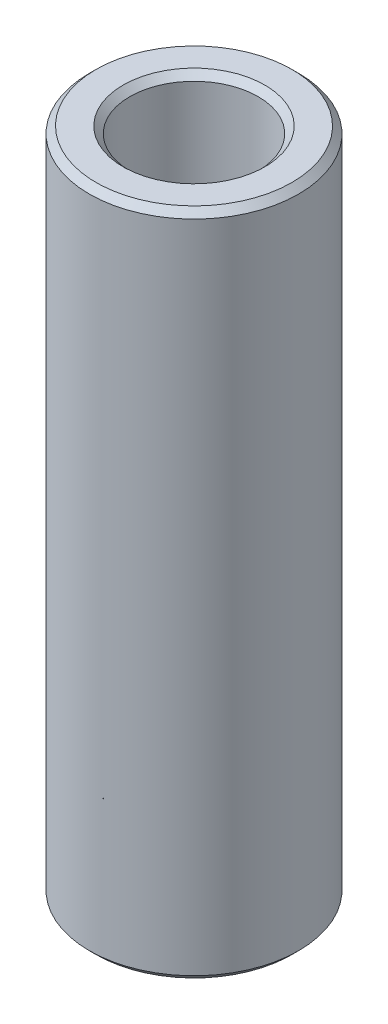
ISO-10303-21;
HEADER;
FILE_DESCRIPTION(('STEP AP214'),'2;1');
FILE_NAME('part.step','',(''),(''),'','','');
FILE_SCHEMA(('AUTOMOTIVE_DESIGN { 1 0 10303 214 1 1 1 1 }'));
ENDSEC;
DATA;
#1=APPLICATION_CONTEXT('core data for automotive mechanical design processes');
#2=APPLICATION_PROTOCOL_DEFINITION('international standard','automotive_design',2000,#1);
#3=PRODUCT_CONTEXT('',#1,'mechanical');
#4=PRODUCT('Part','Part','',(#3));
#5=PRODUCT_RELATED_PRODUCT_CATEGORY('part','',(#4));
#6=PRODUCT_DEFINITION_FORMATION('','',#4);
#7=PRODUCT_DEFINITION_CONTEXT('part definition',#1,'design');
#8=PRODUCT_DEFINITION('design','',#6,#7);
#9=PRODUCT_DEFINITION_SHAPE('','',#8);
#10=(LENGTH_UNIT() NAMED_UNIT(*) SI_UNIT(.MILLI.,.METRE.));
#11=(NAMED_UNIT(*) PLANE_ANGLE_UNIT() SI_UNIT($,.RADIAN.));
#12=(NAMED_UNIT(*) SI_UNIT($,.STERADIAN.) SOLID_ANGLE_UNIT());
#13=UNCERTAINTY_MEASURE_WITH_UNIT(LENGTH_MEASURE(1.E-05),#10,'distance_accuracy_value','');
#14=(GEOMETRIC_REPRESENTATION_CONTEXT(3) GLOBAL_UNCERTAINTY_ASSIGNED_CONTEXT((#13)) GLOBAL_UNIT_ASSIGNED_CONTEXT((#10,
#11,#12)) REPRESENTATION_CONTEXT('',''));
#15=CARTESIAN_POINT('',(0.,0.,0.));
#16=DIRECTION('',(0.,0.,1.));
#17=DIRECTION('',(1.,0.,0.));
#18=AXIS2_PLACEMENT_3D('',#15,#16,#17);
#19=CARTESIAN_POINT('',(0.,25.4,0.));
#20=DIRECTION('',(0.,-1.,0.));
#21=DIRECTION('',(0.,0.,-1.));
#22=AXIS2_PLACEMENT_3D('',#19,#20,#21);
#23=CYLINDRICAL_SURFACE('',#22,2.4384);
#24=CARTESIAN_POINT('',(0.,0.253999999983989,0.));
#25=DIRECTION('',(0.,-1.,0.));
#26=DIRECTION('',(0.,0.,-1.));
#27=AXIS2_PLACEMENT_3D('',#24,#25,#26);
#28=CIRCLE('',#27,2.43840000001683);
#29=CARTESIAN_POINT('',(0.,0.253999999983989,-2.43840000001683));
#30=VERTEX_POINT('',#29);
#31=EDGE_CURVE('E42',#30,#30,#28,.T.);
#32=ORIENTED_EDGE('',*,*,#31,.T.);
#33=EDGE_LOOP('',(#32));
#34=FACE_BOUND('',#33,.T.);
#35=CARTESIAN_POINT('',(0.,25.1460000000066,0.));
#36=DIRECTION('',(0.,1.,0.));
#37=DIRECTION('',(0.,0.,1.));
#38=AXIS2_PLACEMENT_3D('',#35,#36,#37);
#39=CIRCLE('',#38,2.43840000001683);
#40=CARTESIAN_POINT('',(0.,25.1460000000066,2.43840000001683));
#41=VERTEX_POINT('',#40);
#42=EDGE_CURVE('E46',#41,#41,#39,.T.);
#43=ORIENTED_EDGE('',*,*,#42,.T.);
#44=EDGE_LOOP('',(#43));
#45=FACE_BOUND('',#44,.T.);
#46=ADVANCED_FACE('F23',(#34,#45),#23,.F.);
#47=CARTESIAN_POINT('',(0.,25.3999999998769,0.));
#48=DIRECTION('',(0.,1.,0.));
#49=DIRECTION('',(-1.,0.,0.));
#50=AXIS2_PLACEMENT_3D('',#47,#48,#49);
#51=CONICAL_SURFACE('',#50,2.69239999988713,0.785398163397448);
#52=ORIENTED_EDGE('',*,*,#42,.F.);
#53=EDGE_LOOP('',(#52));
#54=FACE_BOUND('',#53,.T.);
#55=CARTESIAN_POINT('',(0.,25.3999999999905,0.));
#56=DIRECTION('',(0.,1.,0.));
#57=DIRECTION('',(-1.,0.,0.));
#58=AXIS2_PLACEMENT_3D('',#55,#56,#57);
#59=CIRCLE('',#58,2.69240000000082);
#60=CARTESIAN_POINT('',(-2.69240000000082,25.3999999999905,0.));
#61=VERTEX_POINT('',#60);
#62=EDGE_CURVE('E26',#61,#61,#59,.F.);
#63=ORIENTED_EDGE('',*,*,#62,.F.);
#64=EDGE_LOOP('',(#63));
#65=FACE_BOUND('',#64,.T.);
#66=ADVANCED_FACE('F69',(#54,#65),#51,.F.);
#67=CARTESIAN_POINT('',(0.,0.,0.));
#68=DIRECTION('',(0.,-1.,0.));
#69=DIRECTION('',(0.,0.,-1.));
#70=AXIS2_PLACEMENT_3D('',#67,#68,#69);
#71=CONICAL_SURFACE('',#70,2.69240000000082,0.785398163397448);
#72=CARTESIAN_POINT('',(0.,0.,0.));
#73=DIRECTION('',(0.,-1.,0.));
#74=DIRECTION('',(0.,0.,-1.));
#75=AXIS2_PLACEMENT_3D('',#72,#73,#74);
#76=CIRCLE('',#75,2.69240000000082);
#77=CARTESIAN_POINT('',(0.,0.,-2.69240000000082));
#78=VERTEX_POINT('',#77);
#79=EDGE_CURVE('E55',#78,#78,#76,.T.);
#80=ORIENTED_EDGE('',*,*,#79,.T.);
#81=EDGE_LOOP('',(#80));
#82=FACE_BOUND('',#81,.T.);
#83=ORIENTED_EDGE('',*,*,#31,.F.);
#84=EDGE_LOOP('',(#83));
#85=FACE_BOUND('',#84,.T.);
#86=ADVANCED_FACE('F71',(#82,#85),#71,.F.);
#87=CARTESIAN_POINT('',(0.,25.4,0.));
#88=DIRECTION('',(0.,1.,0.));
#89=DIRECTION('',(0.,0.,1.));
#90=AXIS2_PLACEMENT_3D('',#87,#88,#89);
#91=PLANE('',#90);
#92=CARTESIAN_POINT('',(0.,25.3999999999905,0.));
#93=DIRECTION('',(0.,-1.,0.));
#94=DIRECTION('',(1.,0.,0.));
#95=AXIS2_PLACEMENT_3D('',#92,#93,#94);
#96=CIRCLE('',#95,3.72110000006387);
#97=CARTESIAN_POINT('',(3.72110000006387,25.3999999999905,0.));
#98=VERTEX_POINT('',#97);
#99=EDGE_CURVE('E52',#98,#98,#96,.T.);
#100=ORIENTED_EDGE('',*,*,#99,.F.);
#101=EDGE_LOOP('',(#100));
#102=FACE_BOUND('',#101,.T.);
#103=ORIENTED_EDGE('',*,*,#62,.T.);
#104=EDGE_LOOP('',(#103));
#105=FACE_BOUND('',#104,.T.);
#106=ADVANCED_FACE('F67',(#102,#105),#91,.T.);
#107=CARTESIAN_POINT('',(0.,0.,0.));
#108=DIRECTION('',(0.,1.,0.));
#109=DIRECTION('',(0.,0.,1.));
#110=AXIS2_PLACEMENT_3D('',#107,#108,#109);
#111=PLANE('',#110);
#112=CARTESIAN_POINT('',(0.,0.,0.));
#113=DIRECTION('',(0.,1.,0.));
#114=DIRECTION('',(0.,0.,1.));
#115=AXIS2_PLACEMENT_3D('',#112,#113,#114);
#116=CIRCLE('',#115,3.72110000000703);
#117=CARTESIAN_POINT('',(0.,0.,3.72110000000703));
#118=VERTEX_POINT('',#117);
#119=EDGE_CURVE('E39',#118,#118,#116,.T.);
#120=ORIENTED_EDGE('',*,*,#119,.F.);
#121=EDGE_LOOP('',(#120));
#122=FACE_BOUND('',#121,.T.);
#123=ORIENTED_EDGE('',*,*,#79,.F.);
#124=EDGE_LOOP('',(#123));
#125=FACE_BOUND('',#124,.T.);
#126=ADVANCED_FACE('F96',(#122,#125),#111,.F.);
#127=CARTESIAN_POINT('',(0.,25.1460000000066,0.));
#128=DIRECTION('',(0.,-1.,0.));
#129=DIRECTION('',(1.,0.,0.));
#130=AXIS2_PLACEMENT_3D('',#127,#128,#129);
#131=CONICAL_SURFACE('',#130,3.97510000004786,0.785398163397448);
#132=CARTESIAN_POINT('',(0.,25.146,0.));
#133=DIRECTION('',(0.,-1.,0.));
#134=DIRECTION('',(0.,0.,-1.));
#135=AXIS2_PLACEMENT_3D('',#132,#133,#134);
#136=CIRCLE('',#135,3.9751);
#137=CARTESIAN_POINT('',(0.,25.146,-3.9751));
#138=VERTEX_POINT('',#137);
#139=EDGE_CURVE('E31',#138,#138,#136,.T.);
#140=ORIENTED_EDGE('',*,*,#139,.F.);
#141=EDGE_LOOP('',(#140));
#142=FACE_BOUND('',#141,.T.);
#143=ORIENTED_EDGE('',*,*,#99,.T.);
#144=EDGE_LOOP('',(#143));
#145=FACE_BOUND('',#144,.T.);
#146=ADVANCED_FACE('F89',(#142,#145),#131,.T.);
#147=CARTESIAN_POINT('',(0.,0.253999999927146,0.));
#148=DIRECTION('',(0.,1.,0.));
#149=DIRECTION('',(0.,0.,1.));
#150=AXIS2_PLACEMENT_3D('',#147,#148,#149);
#151=CONICAL_SURFACE('',#150,3.97509999993417,0.785398163397448);
#152=CARTESIAN_POINT('',(0.,0.253999999999997,0.));
#153=DIRECTION('',(0.,-1.,0.));
#154=DIRECTION('',(0.,0.,-1.));
#155=AXIS2_PLACEMENT_3D('',#152,#153,#154);
#156=CIRCLE('',#155,3.9751);
#157=CARTESIAN_POINT('',(0.,0.253999999999997,-3.9751));
#158=VERTEX_POINT('',#157);
#159=EDGE_CURVE('E12',#158,#158,#156,.F.);
#160=ORIENTED_EDGE('',*,*,#159,.F.);
#161=EDGE_LOOP('',(#160));
#162=FACE_BOUND('',#161,.T.);
#163=ORIENTED_EDGE('',*,*,#119,.T.);
#164=EDGE_LOOP('',(#163));
#165=FACE_BOUND('',#164,.T.);
#166=ADVANCED_FACE('F84',(#162,#165),#151,.T.);
#167=CARTESIAN_POINT('',(0.,25.4,0.));
#168=DIRECTION('',(0.,-1.,0.));
#169=DIRECTION('',(0.,0.,-1.));
#170=AXIS2_PLACEMENT_3D('',#167,#168,#169);
#171=CYLINDRICAL_SURFACE('',#170,3.9751);
#172=ORIENTED_EDGE('',*,*,#159,.T.);
#173=EDGE_LOOP('',(#172));
#174=FACE_BOUND('',#173,.T.);
#175=ORIENTED_EDGE('',*,*,#139,.T.);
#176=EDGE_LOOP('',(#175));
#177=FACE_BOUND('',#176,.T.);
#178=ADVANCED_FACE('F82',(#174,#177),#171,.T.);
#179=CLOSED_SHELL('',(#46,#66,#86,#106,#126,#146,#166,#178));
#180=MANIFOLD_SOLID_BREP('B1',#179);
#181=ADVANCED_BREP_SHAPE_REPRESENTATION('',(#18,#180),#14);
#182=SHAPE_DEFINITION_REPRESENTATION(#9,#181);
ENDSEC;
END-ISO-10303-21;
